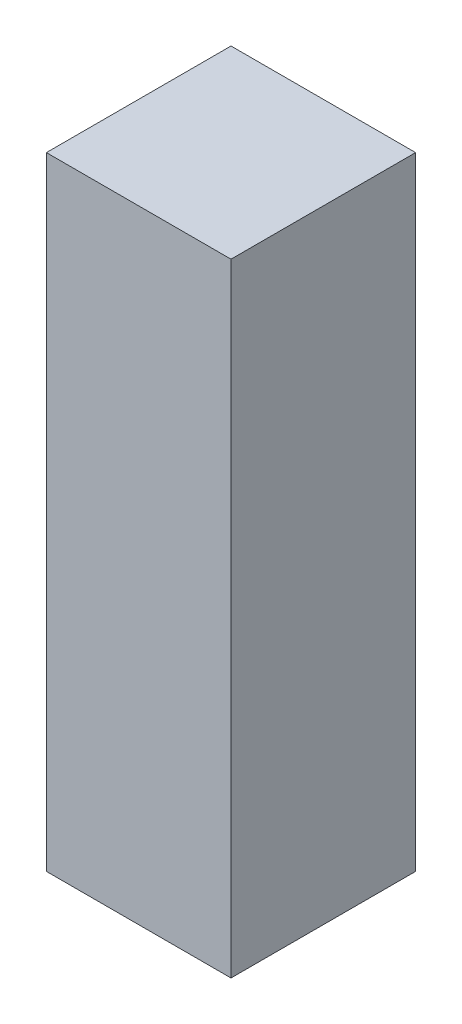
ISO-10303-21;
HEADER;
FILE_DESCRIPTION(('STEP AP214'),'2;1');
FILE_NAME('part.step','',(''),(''),'','','');
FILE_SCHEMA(('AUTOMOTIVE_DESIGN { 1 0 10303 214 1 1 1 1 }'));
ENDSEC;
DATA;
#1=APPLICATION_CONTEXT('core data for automotive mechanical design processes');
#2=APPLICATION_PROTOCOL_DEFINITION('international standard','automotive_design',2000,#1);
#3=PRODUCT_CONTEXT('',#1,'mechanical');
#4=PRODUCT('Part','Part','',(#3));
#5=PRODUCT_RELATED_PRODUCT_CATEGORY('part','',(#4));
#6=PRODUCT_DEFINITION_FORMATION('','',#4);
#7=PRODUCT_DEFINITION_CONTEXT('part definition',#1,'design');
#8=PRODUCT_DEFINITION('design','',#6,#7);
#9=PRODUCT_DEFINITION_SHAPE('','',#8);
#10=(LENGTH_UNIT() NAMED_UNIT(*) SI_UNIT(.MILLI.,.METRE.));
#11=(NAMED_UNIT(*) PLANE_ANGLE_UNIT() SI_UNIT($,.RADIAN.));
#12=(NAMED_UNIT(*) SI_UNIT($,.STERADIAN.) SOLID_ANGLE_UNIT());
#13=UNCERTAINTY_MEASURE_WITH_UNIT(LENGTH_MEASURE(1.E-05),#10,'distance_accuracy_value','');
#14=(GEOMETRIC_REPRESENTATION_CONTEXT(3) GLOBAL_UNCERTAINTY_ASSIGNED_CONTEXT((#13)) GLOBAL_UNIT_ASSIGNED_CONTEXT((#10,
#11,#12)) REPRESENTATION_CONTEXT('',''));
#15=CARTESIAN_POINT('',(0.,0.,0.));
#16=DIRECTION('',(0.,0.,1.));
#17=DIRECTION('',(1.,0.,0.));
#18=AXIS2_PLACEMENT_3D('',#15,#16,#17);
#19=CARTESIAN_POINT('',(15.05,101.5,15.05));
#20=DIRECTION('',(-1.,0.,0.));
#21=DIRECTION('',(0.,0.,1.));
#22=AXIS2_PLACEMENT_3D('',#19,#20,#21);
#23=PLANE('',#22);
#24=DIRECTION('',(0.,0.,-1.));
#25=VECTOR('',#24,1.);
#26=CARTESIAN_POINT('',(15.05,0.,15.05));
#27=LINE('',#26,#25);
#28=CARTESIAN_POINT('',(15.05,0.,15.05));
#29=VERTEX_POINT('',#28);
#30=CARTESIAN_POINT('',(15.05,0.,-15.05));
#31=VERTEX_POINT('',#30);
#32=EDGE_CURVE('E100',#29,#31,#27,.T.);
#33=ORIENTED_EDGE('',*,*,#32,.T.);
#34=DIRECTION('',(0.,-1.,0.));
#35=VECTOR('',#34,1.);
#36=CARTESIAN_POINT('',(15.05,101.5,-15.05));
#37=LINE('',#36,#35);
#38=CARTESIAN_POINT('',(15.05,101.5,-15.05));
#39=VERTEX_POINT('',#38);
#40=EDGE_CURVE('E11',#39,#31,#37,.T.);
#41=ORIENTED_EDGE('',*,*,#40,.F.);
#42=DIRECTION('',(0.,0.,-1.));
#43=VECTOR('',#42,1.);
#44=CARTESIAN_POINT('',(15.05,101.5,15.05));
#45=LINE('',#44,#43);
#46=CARTESIAN_POINT('',(15.05,101.5,15.05));
#47=VERTEX_POINT('',#46);
#48=EDGE_CURVE('E88',#47,#39,#45,.T.);
#49=ORIENTED_EDGE('',*,*,#48,.F.);
#50=DIRECTION('',(0.,-1.,0.));
#51=VECTOR('',#50,1.);
#52=CARTESIAN_POINT('',(15.05,101.5,15.05));
#53=LINE('',#52,#51);
#54=EDGE_CURVE('E96',#47,#29,#53,.T.);
#55=ORIENTED_EDGE('',*,*,#54,.T.);
#56=EDGE_LOOP('',(#33,#41,#49,#55));
#57=FACE_BOUND('',#56,.T.);
#58=ADVANCED_FACE('F37',(#57),#23,.F.);
#59=CARTESIAN_POINT('',(-15.05,101.5,-15.05));
#60=DIRECTION('',(0.,0.,1.));
#61=DIRECTION('',(1.,0.,0.));
#62=AXIS2_PLACEMENT_3D('',#59,#60,#61);
#63=PLANE('',#62);
#64=DIRECTION('',(-1.,0.,0.));
#65=VECTOR('',#64,1.);
#66=CARTESIAN_POINT('',(-15.05,0.,-15.05));
#67=LINE('',#66,#65);
#68=CARTESIAN_POINT('',(-15.05,0.,-15.05));
#69=VERTEX_POINT('',#68);
#70=EDGE_CURVE('E92',#31,#69,#67,.T.);
#71=ORIENTED_EDGE('',*,*,#70,.T.);
#72=DIRECTION('',(0.,-1.,0.));
#73=VECTOR('',#72,1.);
#74=CARTESIAN_POINT('',(-15.05,101.5,-15.05));
#75=LINE('',#74,#73);
#76=CARTESIAN_POINT('',(-15.05,101.5,-15.05));
#77=VERTEX_POINT('',#76);
#78=EDGE_CURVE('E45',#77,#69,#75,.T.);
#79=ORIENTED_EDGE('',*,*,#78,.F.);
#80=DIRECTION('',(-1.,0.,0.));
#81=VECTOR('',#80,1.);
#82=CARTESIAN_POINT('',(-15.05,101.5,-15.05));
#83=LINE('',#82,#81);
#84=EDGE_CURVE('E83',#39,#77,#83,.T.);
#85=ORIENTED_EDGE('',*,*,#84,.F.);
#86=ORIENTED_EDGE('',*,*,#40,.T.);
#87=EDGE_LOOP('',(#71,#79,#85,#86));
#88=FACE_BOUND('',#87,.T.);
#89=ADVANCED_FACE('F91',(#88),#63,.F.);
#90=CARTESIAN_POINT('',(-15.05,101.5,15.05));
#91=DIRECTION('',(1.,0.,0.));
#92=DIRECTION('',(0.,0.,-1.));
#93=AXIS2_PLACEMENT_3D('',#90,#91,#92);
#94=PLANE('',#93);
#95=DIRECTION('',(0.,0.,1.));
#96=VECTOR('',#95,1.);
#97=CARTESIAN_POINT('',(-15.05,0.,15.05));
#98=LINE('',#97,#96);
#99=CARTESIAN_POINT('',(-15.05,0.,15.05));
#100=VERTEX_POINT('',#99);
#101=EDGE_CURVE('E70',#69,#100,#98,.T.);
#102=ORIENTED_EDGE('',*,*,#101,.T.);
#103=DIRECTION('',(0.,-1.,0.));
#104=VECTOR('',#103,1.);
#105=CARTESIAN_POINT('',(-15.05,101.5,15.05));
#106=LINE('',#105,#104);
#107=CARTESIAN_POINT('',(-15.05,101.5,15.05));
#108=VERTEX_POINT('',#107);
#109=EDGE_CURVE('E93',#108,#100,#106,.T.);
#110=ORIENTED_EDGE('',*,*,#109,.F.);
#111=DIRECTION('',(0.,0.,1.));
#112=VECTOR('',#111,1.);
#113=CARTESIAN_POINT('',(-15.05,101.5,15.05));
#114=LINE('',#113,#112);
#115=EDGE_CURVE('E86',#77,#108,#114,.T.);
#116=ORIENTED_EDGE('',*,*,#115,.F.);
#117=ORIENTED_EDGE('',*,*,#78,.T.);
#118=EDGE_LOOP('',(#102,#110,#116,#117));
#119=FACE_BOUND('',#118,.T.);
#120=ADVANCED_FACE('F94',(#119),#94,.F.);
#121=CARTESIAN_POINT('',(-15.05,101.5,15.05));
#122=DIRECTION('',(0.,0.,-1.));
#123=DIRECTION('',(-1.,0.,0.));
#124=AXIS2_PLACEMENT_3D('',#121,#122,#123);
#125=PLANE('',#124);
#126=DIRECTION('',(1.,0.,0.));
#127=VECTOR('',#126,1.);
#128=CARTESIAN_POINT('',(-15.05,0.,15.05));
#129=LINE('',#128,#127);
#130=EDGE_CURVE('E76',#100,#29,#129,.T.);
#131=ORIENTED_EDGE('',*,*,#130,.T.);
#132=ORIENTED_EDGE('',*,*,#54,.F.);
#133=DIRECTION('',(1.,0.,0.));
#134=VECTOR('',#133,1.);
#135=CARTESIAN_POINT('',(-15.05,101.5,15.05));
#136=LINE('',#135,#134);
#137=EDGE_CURVE('E53',#108,#47,#136,.T.);
#138=ORIENTED_EDGE('',*,*,#137,.F.);
#139=ORIENTED_EDGE('',*,*,#109,.T.);
#140=EDGE_LOOP('',(#131,#132,#138,#139));
#141=FACE_BOUND('',#140,.T.);
#142=ADVANCED_FACE('F107',(#141),#125,.F.);
#143=CARTESIAN_POINT('',(0.,101.5,0.));
#144=DIRECTION('',(0.,-1.,0.));
#145=DIRECTION('',(0.,0.,-1.));
#146=AXIS2_PLACEMENT_3D('',#143,#144,#145);
#147=PLANE('',#146);
#148=ORIENTED_EDGE('',*,*,#48,.T.);
#149=ORIENTED_EDGE('',*,*,#84,.T.);
#150=ORIENTED_EDGE('',*,*,#115,.T.);
#151=ORIENTED_EDGE('',*,*,#137,.T.);
#152=EDGE_LOOP('',(#148,#149,#150,#151));
#153=FACE_BOUND('',#152,.T.);
#154=ADVANCED_FACE('F84',(#153),#147,.F.);
#155=CARTESIAN_POINT('',(0.,0.,0.));
#156=DIRECTION('',(0.,-1.,0.));
#157=DIRECTION('',(0.,0.,-1.));
#158=AXIS2_PLACEMENT_3D('',#155,#156,#157);
#159=PLANE('',#158);
#160=ORIENTED_EDGE('',*,*,#32,.F.);
#161=ORIENTED_EDGE('',*,*,#130,.F.);
#162=ORIENTED_EDGE('',*,*,#101,.F.);
#163=ORIENTED_EDGE('',*,*,#70,.F.);
#164=EDGE_LOOP('',(#160,#161,#162,#163));
#165=FACE_BOUND('',#164,.T.);
#166=ADVANCED_FACE('F110',(#165),#159,.T.);
#167=CLOSED_SHELL('',(#58,#89,#120,#142,#154,#166));
#168=MANIFOLD_SOLID_BREP('B2',#167);
#169=ADVANCED_BREP_SHAPE_REPRESENTATION('',(#18,#168),#14);
#170=SHAPE_DEFINITION_REPRESENTATION(#9,#169);
ENDSEC;
END-ISO-10303-21;
